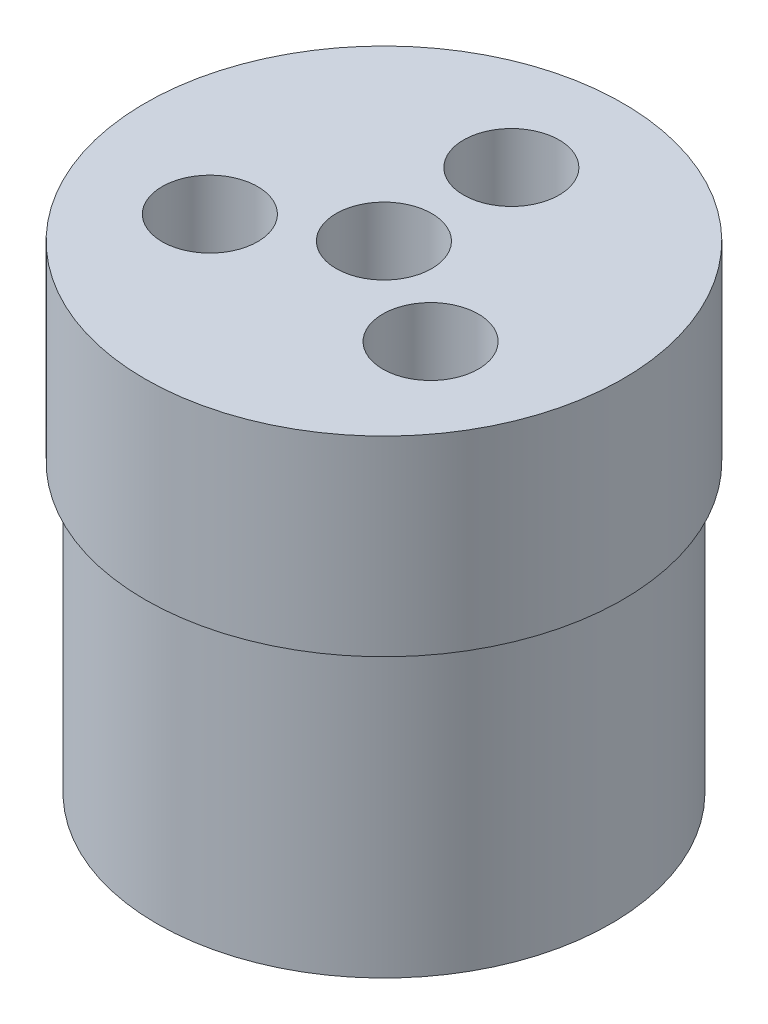
ISO-10303-21;
HEADER;
FILE_DESCRIPTION(('STEP AP214'),'2;1');
FILE_NAME('part.step','',(''),(''),'','','');
FILE_SCHEMA(('AUTOMOTIVE_DESIGN { 1 0 10303 214 1 1 1 1 }'));
ENDSEC;
DATA;
#1=APPLICATION_CONTEXT('core data for automotive mechanical design processes');
#2=APPLICATION_PROTOCOL_DEFINITION('international standard','automotive_design',2000,#1);
#3=PRODUCT_CONTEXT('',#1,'mechanical');
#4=PRODUCT('Part','Part','',(#3));
#5=PRODUCT_RELATED_PRODUCT_CATEGORY('part','',(#4));
#6=PRODUCT_DEFINITION_FORMATION('','',#4);
#7=PRODUCT_DEFINITION_CONTEXT('part definition',#1,'design');
#8=PRODUCT_DEFINITION('design','',#6,#7);
#9=PRODUCT_DEFINITION_SHAPE('','',#8);
#10=(LENGTH_UNIT() NAMED_UNIT(*) SI_UNIT(.MILLI.,.METRE.));
#11=(NAMED_UNIT(*) PLANE_ANGLE_UNIT() SI_UNIT($,.RADIAN.));
#12=(NAMED_UNIT(*) SI_UNIT($,.STERADIAN.) SOLID_ANGLE_UNIT());
#13=UNCERTAINTY_MEASURE_WITH_UNIT(LENGTH_MEASURE(1.E-05),#10,'distance_accuracy_value','');
#14=(GEOMETRIC_REPRESENTATION_CONTEXT(3) GLOBAL_UNCERTAINTY_ASSIGNED_CONTEXT((#13)) GLOBAL_UNIT_ASSIGNED_CONTEXT((#10,
#11,#12)) REPRESENTATION_CONTEXT('',''));
#15=CARTESIAN_POINT('',(0.,0.,0.));
#16=DIRECTION('',(0.,0.,1.));
#17=DIRECTION('',(1.,0.,0.));
#18=AXIS2_PLACEMENT_3D('',#15,#16,#17);
#19=CARTESIAN_POINT('',(0.,15.,0.));
#20=DIRECTION('',(0.,-1.,0.));
#21=DIRECTION('',(0.,0.,-1.));
#22=AXIS2_PLACEMENT_3D('',#19,#20,#21);
#23=CYLINDRICAL_SURFACE('',#22,14.25);
#24=CARTESIAN_POINT('',(0.,-15.,0.));
#25=DIRECTION('',(0.,1.,0.));
#26=DIRECTION('',(0.,0.,1.));
#27=AXIS2_PLACEMENT_3D('',#24,#25,#26);
#28=CIRCLE('',#27,14.25);
#29=CARTESIAN_POINT('',(0.,-15.,14.25));
#30=VERTEX_POINT('',#29);
#31=EDGE_CURVE('E36',#30,#30,#28,.T.);
#32=ORIENTED_EDGE('',*,*,#31,.T.);
#33=EDGE_LOOP('',(#32));
#34=FACE_BOUND('',#33,.T.);
#35=CARTESIAN_POINT('',(0.,3.,0.));
#36=DIRECTION('',(0.,1.,0.));
#37=DIRECTION('',(0.,0.,1.));
#38=AXIS2_PLACEMENT_3D('',#35,#36,#37);
#39=CIRCLE('',#38,14.25);
#40=CARTESIAN_POINT('',(0.,3.,14.25));
#41=VERTEX_POINT('',#40);
#42=EDGE_CURVE('E10',#41,#41,#39,.T.);
#43=ORIENTED_EDGE('',*,*,#42,.F.);
#44=EDGE_LOOP('',(#43));
#45=FACE_BOUND('',#44,.T.);
#46=ADVANCED_FACE('F30',(#34,#45),#23,.T.);
#47=CARTESIAN_POINT('',(0.,15.,0.));
#48=DIRECTION('',(0.,1.,0.));
#49=DIRECTION('',(0.,0.,1.));
#50=AXIS2_PLACEMENT_3D('',#47,#48,#49);
#51=PLANE('',#50);
#52=CARTESIAN_POINT('',(6.92820323027555,15.,3.99999999999994));
#53=DIRECTION('',(0.,1.,0.));
#54=DIRECTION('',(0.,0.,1.));
#55=AXIS2_PLACEMENT_3D('',#52,#53,#54);
#56=CIRCLE('',#55,2.99999999999999);
#57=CARTESIAN_POINT('',(6.92820323027555,15.,6.99999999999992));
#58=VERTEX_POINT('',#57);
#59=EDGE_CURVE('E64',#58,#58,#56,.T.);
#60=ORIENTED_EDGE('',*,*,#59,.F.);
#61=EDGE_LOOP('',(#60));
#62=FACE_BOUND('',#61,.T.);
#63=CARTESIAN_POINT('',(-6.92820323027549,15.,4.00000000000003));
#64=DIRECTION('',(0.,1.,0.));
#65=DIRECTION('',(0.,0.,1.));
#66=AXIS2_PLACEMENT_3D('',#63,#64,#65);
#67=CIRCLE('',#66,2.99999999999999);
#68=CARTESIAN_POINT('',(-6.92820323027549,15.,7.00000000000002));
#69=VERTEX_POINT('',#68);
#70=EDGE_CURVE('E58',#69,#69,#67,.T.);
#71=ORIENTED_EDGE('',*,*,#70,.F.);
#72=EDGE_LOOP('',(#71));
#73=FACE_BOUND('',#72,.T.);
#74=CARTESIAN_POINT('',(0.,15.,-8.));
#75=DIRECTION('',(0.,1.,0.));
#76=DIRECTION('',(0.,0.,1.));
#77=AXIS2_PLACEMENT_3D('',#74,#75,#76);
#78=CIRCLE('',#77,2.99999999999999);
#79=CARTESIAN_POINT('',(0.,15.,-5.00000000000001));
#80=VERTEX_POINT('',#79);
#81=EDGE_CURVE('E52',#80,#80,#78,.T.);
#82=ORIENTED_EDGE('',*,*,#81,.F.);
#83=EDGE_LOOP('',(#82));
#84=FACE_BOUND('',#83,.T.);
#85=CARTESIAN_POINT('',(0.,15.,0.));
#86=DIRECTION('',(0.,1.,0.));
#87=DIRECTION('',(0.,0.,1.));
#88=AXIS2_PLACEMENT_3D('',#85,#86,#87);
#89=CIRCLE('',#88,3.);
#90=CARTESIAN_POINT('',(0.,15.,3.));
#91=VERTEX_POINT('',#90);
#92=EDGE_CURVE('E44',#91,#91,#89,.T.);
#93=ORIENTED_EDGE('',*,*,#92,.F.);
#94=EDGE_LOOP('',(#93));
#95=FACE_BOUND('',#94,.T.);
#96=CARTESIAN_POINT('',(0.,15.,0.));
#97=DIRECTION('',(0.,1.,0.));
#98=DIRECTION('',(0.,0.,1.));
#99=AXIS2_PLACEMENT_3D('',#96,#97,#98);
#100=CIRCLE('',#99,15.);
#101=CARTESIAN_POINT('',(0.,15.,15.));
#102=VERTEX_POINT('',#101);
#103=EDGE_CURVE('E68',#102,#102,#100,.T.);
#104=ORIENTED_EDGE('',*,*,#103,.T.);
#105=EDGE_LOOP('',(#104));
#106=FACE_BOUND('',#105,.T.);
#107=ADVANCED_FACE('F86',(#62,#73,#84,#95,#106),#51,.T.);
#108=CARTESIAN_POINT('',(0.,-15.,0.));
#109=DIRECTION('',(0.,1.,0.));
#110=DIRECTION('',(0.,0.,1.));
#111=AXIS2_PLACEMENT_3D('',#108,#109,#110);
#112=PLANE('',#111);
#113=CARTESIAN_POINT('',(6.92820323027555,-15.,3.99999999999994));
#114=DIRECTION('',(0.,1.,0.));
#115=DIRECTION('',(0.,0.,1.));
#116=AXIS2_PLACEMENT_3D('',#113,#114,#115);
#117=CIRCLE('',#116,2.99999999999999);
#118=CARTESIAN_POINT('',(6.92820323027555,-15.,6.99999999999993));
#119=VERTEX_POINT('',#118);
#120=EDGE_CURVE('E61',#119,#119,#117,.T.);
#121=ORIENTED_EDGE('',*,*,#120,.T.);
#122=EDGE_LOOP('',(#121));
#123=FACE_BOUND('',#122,.T.);
#124=CARTESIAN_POINT('',(-6.92820323027549,-15.,4.00000000000003));
#125=DIRECTION('',(0.,1.,0.));
#126=DIRECTION('',(0.,0.,1.));
#127=AXIS2_PLACEMENT_3D('',#124,#125,#126);
#128=CIRCLE('',#127,2.99999999999999);
#129=CARTESIAN_POINT('',(-6.92820323027549,-15.,7.00000000000003));
#130=VERTEX_POINT('',#129);
#131=EDGE_CURVE('E55',#130,#130,#128,.T.);
#132=ORIENTED_EDGE('',*,*,#131,.T.);
#133=EDGE_LOOP('',(#132));
#134=FACE_BOUND('',#133,.T.);
#135=CARTESIAN_POINT('',(0.,-15.,-8.));
#136=DIRECTION('',(0.,1.,0.));
#137=DIRECTION('',(0.,0.,1.));
#138=AXIS2_PLACEMENT_3D('',#135,#136,#137);
#139=CIRCLE('',#138,2.99999999999999);
#140=CARTESIAN_POINT('',(0.,-15.,-5.00000000000001));
#141=VERTEX_POINT('',#140);
#142=EDGE_CURVE('E49',#141,#141,#139,.T.);
#143=ORIENTED_EDGE('',*,*,#142,.T.);
#144=EDGE_LOOP('',(#143));
#145=FACE_BOUND('',#144,.T.);
#146=CARTESIAN_POINT('',(0.,-15.,0.));
#147=DIRECTION('',(0.,1.,0.));
#148=DIRECTION('',(0.,0.,1.));
#149=AXIS2_PLACEMENT_3D('',#146,#147,#148);
#150=CIRCLE('',#149,2.99999999999999);
#151=CARTESIAN_POINT('',(0.,-15.,2.99999999999999));
#152=VERTEX_POINT('',#151);
#153=EDGE_CURVE('E40',#152,#152,#150,.T.);
#154=ORIENTED_EDGE('',*,*,#153,.T.);
#155=EDGE_LOOP('',(#154));
#156=FACE_BOUND('',#155,.T.);
#157=ORIENTED_EDGE('',*,*,#31,.F.);
#158=EDGE_LOOP('',(#157));
#159=FACE_BOUND('',#158,.T.);
#160=ADVANCED_FACE('F90',(#123,#134,#145,#156,#159),#112,.F.);
#161=CARTESIAN_POINT('',(0.,15.,0.));
#162=DIRECTION('',(0.,1.,0.));
#163=DIRECTION('',(0.,0.,1.));
#164=AXIS2_PLACEMENT_3D('',#161,#162,#163);
#165=CYLINDRICAL_SURFACE('',#164,3.);
#166=ORIENTED_EDGE('',*,*,#153,.F.);
#167=EDGE_LOOP('',(#166));
#168=FACE_BOUND('',#167,.T.);
#169=ORIENTED_EDGE('',*,*,#92,.T.);
#170=EDGE_LOOP('',(#169));
#171=FACE_BOUND('',#170,.T.);
#172=ADVANCED_FACE('F97',(#168,#171),#165,.F.);
#173=CARTESIAN_POINT('',(0.,15.,-8.));
#174=DIRECTION('',(0.,1.,0.));
#175=DIRECTION('',(0.,0.,1.));
#176=AXIS2_PLACEMENT_3D('',#173,#174,#175);
#177=CYLINDRICAL_SURFACE('',#176,2.99999999999999);
#178=ORIENTED_EDGE('',*,*,#142,.F.);
#179=EDGE_LOOP('',(#178));
#180=FACE_BOUND('',#179,.T.);
#181=ORIENTED_EDGE('',*,*,#81,.T.);
#182=EDGE_LOOP('',(#181));
#183=FACE_BOUND('',#182,.T.);
#184=ADVANCED_FACE('F104',(#180,#183),#177,.F.);
#185=CARTESIAN_POINT('',(-6.92820323027549,15.,4.00000000000003));
#186=DIRECTION('',(0.,1.,0.));
#187=DIRECTION('',(0.,0.,1.));
#188=AXIS2_PLACEMENT_3D('',#185,#186,#187);
#189=CYLINDRICAL_SURFACE('',#188,2.99999999999999);
#190=ORIENTED_EDGE('',*,*,#131,.F.);
#191=EDGE_LOOP('',(#190));
#192=FACE_BOUND('',#191,.T.);
#193=ORIENTED_EDGE('',*,*,#70,.T.);
#194=EDGE_LOOP('',(#193));
#195=FACE_BOUND('',#194,.T.);
#196=ADVANCED_FACE('F108',(#192,#195),#189,.F.);
#197=CARTESIAN_POINT('',(6.92820323027555,15.,3.99999999999994));
#198=DIRECTION('',(0.,1.,0.));
#199=DIRECTION('',(0.,0.,1.));
#200=AXIS2_PLACEMENT_3D('',#197,#198,#199);
#201=CYLINDRICAL_SURFACE('',#200,2.99999999999999);
#202=ORIENTED_EDGE('',*,*,#120,.F.);
#203=EDGE_LOOP('',(#202));
#204=FACE_BOUND('',#203,.T.);
#205=ORIENTED_EDGE('',*,*,#59,.T.);
#206=EDGE_LOOP('',(#205));
#207=FACE_BOUND('',#206,.T.);
#208=ADVANCED_FACE('F83',(#204,#207),#201,.F.);
#209=CARTESIAN_POINT('',(0.,3.,0.));
#210=DIRECTION('',(0.,1.,0.));
#211=DIRECTION('',(0.,0.,1.));
#212=AXIS2_PLACEMENT_3D('',#209,#210,#211);
#213=CYLINDRICAL_SURFACE('',#212,15.);
#214=CARTESIAN_POINT('',(0.,3.,0.));
#215=DIRECTION('',(0.,1.,0.));
#216=DIRECTION('',(0.,0.,1.));
#217=AXIS2_PLACEMENT_3D('',#214,#215,#216);
#218=CIRCLE('',#217,15.);
#219=CARTESIAN_POINT('',(0.,3.,15.));
#220=VERTEX_POINT('',#219);
#221=EDGE_CURVE('E67',#220,#220,#218,.T.);
#222=ORIENTED_EDGE('',*,*,#221,.T.);
#223=EDGE_LOOP('',(#222));
#224=FACE_BOUND('',#223,.T.);
#225=ORIENTED_EDGE('',*,*,#103,.F.);
#226=EDGE_LOOP('',(#225));
#227=FACE_BOUND('',#226,.T.);
#228=ADVANCED_FACE('F74',(#224,#227),#213,.T.);
#229=CARTESIAN_POINT('',(0.,3.,0.));
#230=DIRECTION('',(0.,1.,0.));
#231=DIRECTION('',(0.,0.,1.));
#232=AXIS2_PLACEMENT_3D('',#229,#230,#231);
#233=PLANE('',#232);
#234=ORIENTED_EDGE('',*,*,#42,.T.);
#235=EDGE_LOOP('',(#234));
#236=FACE_BOUND('',#235,.T.);
#237=ORIENTED_EDGE('',*,*,#221,.F.);
#238=EDGE_LOOP('',(#237));
#239=FACE_BOUND('',#238,.T.);
#240=ADVANCED_FACE('F77',(#236,#239),#233,.F.);
#241=CLOSED_SHELL('',(#46,#107,#160,#172,#184,#196,#208,#228,#240));
#242=MANIFOLD_SOLID_BREP('B2',#241);
#243=ADVANCED_BREP_SHAPE_REPRESENTATION('',(#18,#242),#14);
#244=SHAPE_DEFINITION_REPRESENTATION(#9,#243);
ENDSEC;
END-ISO-10303-21;
